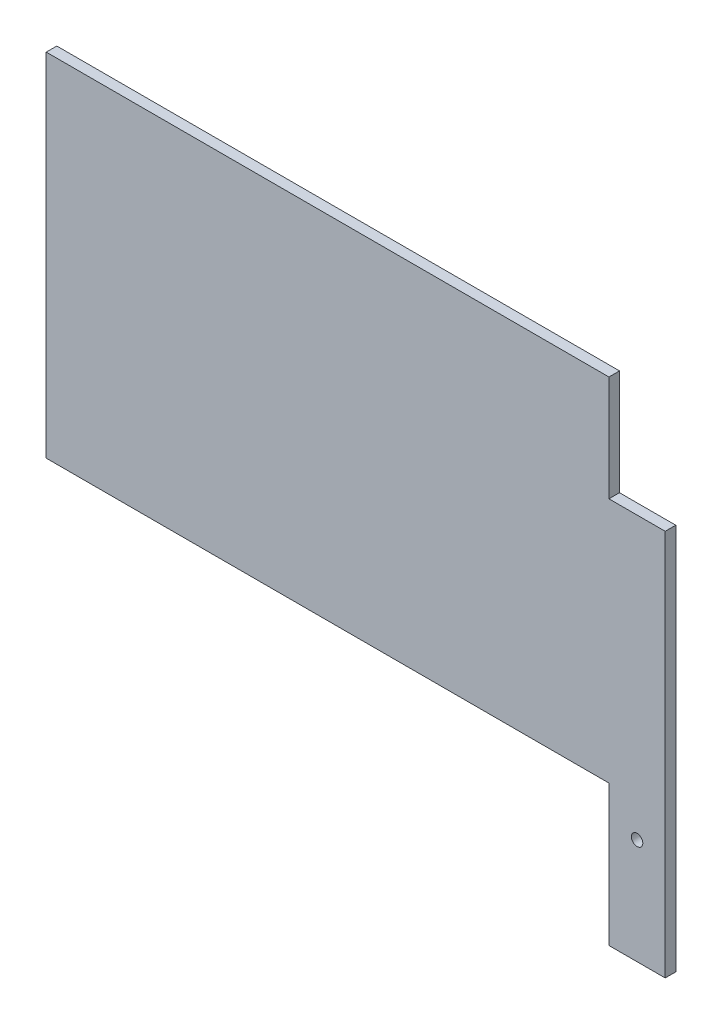
ISO-10303-21;
HEADER;
FILE_DESCRIPTION(('STEP AP214'),'2;1');
FILE_NAME('part.step','',(''),(''),'','','');
FILE_SCHEMA(('AUTOMOTIVE_DESIGN { 1 0 10303 214 1 1 1 1 }'));
ENDSEC;
DATA;
#1=APPLICATION_CONTEXT('core data for automotive mechanical design processes');
#2=APPLICATION_PROTOCOL_DEFINITION('international standard','automotive_design',2000,#1);
#3=PRODUCT_CONTEXT('',#1,'mechanical');
#4=PRODUCT('Part','Part','',(#3));
#5=PRODUCT_RELATED_PRODUCT_CATEGORY('part','',(#4));
#6=PRODUCT_DEFINITION_FORMATION('','',#4);
#7=PRODUCT_DEFINITION_CONTEXT('part definition',#1,'design');
#8=PRODUCT_DEFINITION('design','',#6,#7);
#9=PRODUCT_DEFINITION_SHAPE('','',#8);
#10=(LENGTH_UNIT() NAMED_UNIT(*) SI_UNIT(.MILLI.,.METRE.));
#11=(NAMED_UNIT(*) PLANE_ANGLE_UNIT() SI_UNIT($,.RADIAN.));
#12=(NAMED_UNIT(*) SI_UNIT($,.STERADIAN.) SOLID_ANGLE_UNIT());
#13=UNCERTAINTY_MEASURE_WITH_UNIT(LENGTH_MEASURE(1.E-05),#10,'distance_accuracy_value','');
#14=(GEOMETRIC_REPRESENTATION_CONTEXT(3) GLOBAL_UNCERTAINTY_ASSIGNED_CONTEXT((#13)) GLOBAL_UNIT_ASSIGNED_CONTEXT((#10,
#11,#12)) REPRESENTATION_CONTEXT('',''));
#15=CARTESIAN_POINT('',(0.,0.,0.));
#16=DIRECTION('',(0.,0.,1.));
#17=DIRECTION('',(1.,0.,0.));
#18=AXIS2_PLACEMENT_3D('',#15,#16,#17);
#19=CARTESIAN_POINT('',(53.2510288065843,19.5473251028807,1.5));
#20=DIRECTION('',(-1.,0.,0.));
#21=DIRECTION('',(0.,-1.,0.));
#22=AXIS2_PLACEMENT_3D('',#19,#20,#21);
#23=PLANE('',#22);
#24=DIRECTION('',(0.,0.,1.));
#25=VECTOR('',#24,1.);
#26=CARTESIAN_POINT('',(53.2510288065843,4.54732510288065,1.5));
#27=LINE('',#26,#25);
#28=CARTESIAN_POINT('',(53.2510288065843,4.54732510288065,0.));
#29=VERTEX_POINT('',#28);
#30=CARTESIAN_POINT('',(53.2510288065843,4.54732510288065,1.5));
#31=VERTEX_POINT('',#30);
#32=EDGE_CURVE('E56',#29,#31,#27,.T.);
#33=ORIENTED_EDGE('',*,*,#32,.F.);
#34=DIRECTION('',(0.,1.,0.));
#35=VECTOR('',#34,1.);
#36=CARTESIAN_POINT('',(53.2510288065843,19.5473251028807,0.));
#37=LINE('',#36,#35);
#38=CARTESIAN_POINT('',(53.2510288065843,19.5473251028807,0.));
#39=VERTEX_POINT('',#38);
#40=EDGE_CURVE('E158',#29,#39,#37,.T.);
#41=ORIENTED_EDGE('',*,*,#40,.T.);
#42=DIRECTION('',(0.,0.,-1.));
#43=VECTOR('',#42,1.);
#44=CARTESIAN_POINT('',(53.2510288065843,19.5473251028807,1.5));
#45=LINE('',#44,#43);
#46=CARTESIAN_POINT('',(53.2510288065843,19.5473251028807,1.5));
#47=VERTEX_POINT('',#46);
#48=EDGE_CURVE('E163',#47,#39,#45,.T.);
#49=ORIENTED_EDGE('',*,*,#48,.F.);
#50=DIRECTION('',(0.,1.,0.));
#51=VECTOR('',#50,1.);
#52=CARTESIAN_POINT('',(53.2510288065843,19.5473251028807,1.5));
#53=LINE('',#52,#51);
#54=EDGE_CURVE('E52',#31,#47,#53,.T.);
#55=ORIENTED_EDGE('',*,*,#54,.F.);
#56=EDGE_LOOP('',(#33,#41,#49,#55));
#57=FACE_BOUND('',#56,.T.);
#58=ADVANCED_FACE('F37',(#57),#23,.F.);
#59=CARTESIAN_POINT('',(-26.7489711934157,19.5473251028807,1.5));
#60=DIRECTION('',(1.,0.,0.));
#61=DIRECTION('',(0.,1.,0.));
#62=AXIS2_PLACEMENT_3D('',#59,#60,#61);
#63=PLANE('',#62);
#64=DIRECTION('',(0.,-1.,0.));
#65=VECTOR('',#64,1.);
#66=CARTESIAN_POINT('',(-26.7489711934157,19.5473251028807,0.));
#67=LINE('',#66,#65);
#68=CARTESIAN_POINT('',(-26.7489711934157,19.5473251028807,0.));
#69=VERTEX_POINT('',#68);
#70=CARTESIAN_POINT('',(-26.7489711934156,-30.4526748971193,0.));
#71=VERTEX_POINT('',#70);
#72=EDGE_CURVE('E142',#69,#71,#67,.T.);
#73=ORIENTED_EDGE('',*,*,#72,.T.);
#74=DIRECTION('',(0.,0.,-1.));
#75=VECTOR('',#74,1.);
#76=CARTESIAN_POINT('',(-26.7489711934156,-30.4526748971193,1.5));
#77=LINE('',#76,#75);
#78=CARTESIAN_POINT('',(-26.7489711934156,-30.4526748971193,1.5));
#79=VERTEX_POINT('',#78);
#80=EDGE_CURVE('E11',#79,#71,#77,.T.);
#81=ORIENTED_EDGE('',*,*,#80,.F.);
#82=DIRECTION('',(0.,-1.,0.));
#83=VECTOR('',#82,1.);
#84=CARTESIAN_POINT('',(-26.7489711934157,19.5473251028807,1.5));
#85=LINE('',#84,#83);
#86=CARTESIAN_POINT('',(-26.7489711934157,19.5473251028807,1.5));
#87=VERTEX_POINT('',#86);
#88=EDGE_CURVE('E143',#87,#79,#85,.T.);
#89=ORIENTED_EDGE('',*,*,#88,.F.);
#90=DIRECTION('',(0.,0.,-1.));
#91=VECTOR('',#90,1.);
#92=CARTESIAN_POINT('',(-26.7489711934157,19.5473251028807,1.5));
#93=LINE('',#92,#91);
#94=EDGE_CURVE('E153',#87,#69,#93,.T.);
#95=ORIENTED_EDGE('',*,*,#94,.T.);
#96=EDGE_LOOP('',(#73,#81,#89,#95));
#97=FACE_BOUND('',#96,.T.);
#98=ADVANCED_FACE('F39',(#97),#63,.F.);
#99=CARTESIAN_POINT('',(-26.7489711934156,-30.4526748971193,1.5));
#100=DIRECTION('',(0.,1.,0.));
#101=DIRECTION('',(0.,0.,1.));
#102=AXIS2_PLACEMENT_3D('',#99,#100,#101);
#103=PLANE('',#102);
#104=DIRECTION('',(1.,0.,0.));
#105=VECTOR('',#104,1.);
#106=CARTESIAN_POINT('',(-26.7489711934156,-30.4526748971193,0.));
#107=LINE('',#106,#105);
#108=CARTESIAN_POINT('',(53.2510288065843,-30.4526748971193,0.));
#109=VERTEX_POINT('',#108);
#110=EDGE_CURVE('E156',#71,#109,#107,.T.);
#111=ORIENTED_EDGE('',*,*,#110,.T.);
#112=DIRECTION('',(0.,0.,-1.));
#113=VECTOR('',#112,1.);
#114=CARTESIAN_POINT('',(53.2510288065843,-30.4526748971193,1.5));
#115=LINE('',#114,#113);
#116=CARTESIAN_POINT('',(53.2510288065843,-30.4526748971193,1.5));
#117=VERTEX_POINT('',#116);
#118=EDGE_CURVE('E45',#117,#109,#115,.T.);
#119=ORIENTED_EDGE('',*,*,#118,.F.);
#120=DIRECTION('',(1.,0.,0.));
#121=VECTOR('',#120,1.);
#122=CARTESIAN_POINT('',(-26.7489711934156,-30.4526748971193,1.5));
#123=LINE('',#122,#121);
#124=EDGE_CURVE('E146',#79,#117,#123,.T.);
#125=ORIENTED_EDGE('',*,*,#124,.F.);
#126=ORIENTED_EDGE('',*,*,#80,.T.);
#127=EDGE_LOOP('',(#111,#119,#125,#126));
#128=FACE_BOUND('',#127,.T.);
#129=ADVANCED_FACE('F211',(#128),#103,.F.);
#130=CARTESIAN_POINT('',(-26.7489711934157,19.5473251028807,1.5));
#131=DIRECTION('',(0.,-1.,0.));
#132=DIRECTION('',(0.,0.,-1.));
#133=AXIS2_PLACEMENT_3D('',#130,#131,#132);
#134=PLANE('',#133);
#135=DIRECTION('',(-1.,0.,0.));
#136=VECTOR('',#135,1.);
#137=CARTESIAN_POINT('',(-26.7489711934157,19.5473251028807,0.));
#138=LINE('',#137,#136);
#139=EDGE_CURVE('E147',#39,#69,#138,.T.);
#140=ORIENTED_EDGE('',*,*,#139,.T.);
#141=ORIENTED_EDGE('',*,*,#94,.F.);
#142=DIRECTION('',(-1.,0.,0.));
#143=VECTOR('',#142,1.);
#144=CARTESIAN_POINT('',(-26.7489711934157,19.5473251028807,1.5));
#145=LINE('',#144,#143);
#146=EDGE_CURVE('E151',#47,#87,#145,.T.);
#147=ORIENTED_EDGE('',*,*,#146,.F.);
#148=ORIENTED_EDGE('',*,*,#48,.T.);
#149=EDGE_LOOP('',(#140,#141,#147,#148));
#150=FACE_BOUND('',#149,.T.);
#151=ADVANCED_FACE('F168',(#150),#134,.F.);
#152=CARTESIAN_POINT('',(0.,0.,1.5));
#153=DIRECTION('',(0.,0.,1.));
#154=DIRECTION('',(1.,0.,0.));
#155=AXIS2_PLACEMENT_3D('',#152,#153,#154);
#156=PLANE('',#155);
#157=CARTESIAN_POINT('',(57.2510288065843,-35.4526748971193,1.5));
#158=DIRECTION('',(0.,0.,-1.));
#159=DIRECTION('',(0.,1.,0.));
#160=AXIS2_PLACEMENT_3D('',#157,#158,#159);
#161=CIRCLE('',#160,0.815000000000004);
#162=CARTESIAN_POINT('',(57.2510288065843,-34.6376748971193,1.5));
#163=VERTEX_POINT('',#162);
#164=EDGE_CURVE('E121',#163,#163,#161,.T.);
#165=ORIENTED_EDGE('',*,*,#164,.T.);
#166=EDGE_LOOP('',(#165));
#167=FACE_BOUND('',#166,.T.);
#168=ORIENTED_EDGE('',*,*,#88,.T.);
#169=ORIENTED_EDGE('',*,*,#124,.T.);
#170=DIRECTION('',(0.,1.,0.));
#171=VECTOR('',#170,1.);
#172=CARTESIAN_POINT('',(53.2510288065843,-50.4526748971194,1.5));
#173=LINE('',#172,#171);
#174=CARTESIAN_POINT('',(53.2510288065843,-50.4526748971194,1.5));
#175=VERTEX_POINT('',#174);
#176=EDGE_CURVE('E125',#175,#117,#173,.T.);
#177=ORIENTED_EDGE('',*,*,#176,.F.);
#178=DIRECTION('',(-1.,0.,0.));
#179=VECTOR('',#178,1.);
#180=CARTESIAN_POINT('',(53.2510288065843,-50.4526748971194,1.5));
#181=LINE('',#180,#179);
#182=CARTESIAN_POINT('',(61.2510288065843,-50.4526748971194,1.5));
#183=VERTEX_POINT('',#182);
#184=EDGE_CURVE('E118',#183,#175,#181,.T.);
#185=ORIENTED_EDGE('',*,*,#184,.F.);
#186=DIRECTION('',(0.,-1.,0.));
#187=VECTOR('',#186,1.);
#188=CARTESIAN_POINT('',(61.2510288065843,4.54732510288065,1.5));
#189=LINE('',#188,#187);
#190=CARTESIAN_POINT('',(61.2510288065843,4.54732510288065,1.5));
#191=VERTEX_POINT('',#190);
#192=EDGE_CURVE('E127',#191,#183,#189,.T.);
#193=ORIENTED_EDGE('',*,*,#192,.F.);
#194=DIRECTION('',(-1.,0.,0.));
#195=VECTOR('',#194,1.);
#196=CARTESIAN_POINT('',(61.2510288065843,4.54732510288065,1.5));
#197=LINE('',#196,#195);
#198=EDGE_CURVE('E135',#191,#31,#197,.T.);
#199=ORIENTED_EDGE('',*,*,#198,.T.);
#200=ORIENTED_EDGE('',*,*,#54,.T.);
#201=ORIENTED_EDGE('',*,*,#146,.T.);
#202=EDGE_LOOP('',(#168,#169,#177,#185,#193,#199,#200,#201));
#203=FACE_BOUND('',#202,.T.);
#204=ADVANCED_FACE('F174',(#167,#203),#156,.T.);
#205=CARTESIAN_POINT('',(0.,0.,0.));
#206=DIRECTION('',(0.,0.,1.));
#207=DIRECTION('',(1.,0.,0.));
#208=AXIS2_PLACEMENT_3D('',#205,#206,#207);
#209=PLANE('',#208);
#210=CARTESIAN_POINT('',(57.2510288065843,-35.4526748971193,0.));
#211=DIRECTION('',(0.,0.,-1.));
#212=DIRECTION('',(0.,1.,0.));
#213=AXIS2_PLACEMENT_3D('',#210,#211,#212);
#214=CIRCLE('',#213,0.815000000000004);
#215=CARTESIAN_POINT('',(57.2510288065843,-34.6376748971193,0.));
#216=VERTEX_POINT('',#215);
#217=EDGE_CURVE('E184',#216,#216,#214,.T.);
#218=ORIENTED_EDGE('',*,*,#217,.F.);
#219=EDGE_LOOP('',(#218));
#220=FACE_BOUND('',#219,.T.);
#221=ORIENTED_EDGE('',*,*,#72,.F.);
#222=ORIENTED_EDGE('',*,*,#139,.F.);
#223=ORIENTED_EDGE('',*,*,#40,.F.);
#224=DIRECTION('',(-1.,0.,0.));
#225=VECTOR('',#224,1.);
#226=CARTESIAN_POINT('',(61.2510288065843,4.54732510288065,0.));
#227=LINE('',#226,#225);
#228=CARTESIAN_POINT('',(61.2510288065843,4.54732510288065,0.));
#229=VERTEX_POINT('',#228);
#230=EDGE_CURVE('E139',#229,#29,#227,.T.);
#231=ORIENTED_EDGE('',*,*,#230,.F.);
#232=DIRECTION('',(0.,1.,0.));
#233=VECTOR('',#232,1.);
#234=CARTESIAN_POINT('',(61.2510288065843,4.54732510288065,0.));
#235=LINE('',#234,#233);
#236=CARTESIAN_POINT('',(61.2510288065843,-50.4526748971194,0.));
#237=VERTEX_POINT('',#236);
#238=EDGE_CURVE('E108',#237,#229,#235,.T.);
#239=ORIENTED_EDGE('',*,*,#238,.F.);
#240=DIRECTION('',(1.,0.,0.));
#241=VECTOR('',#240,1.);
#242=CARTESIAN_POINT('',(53.2510288065843,-50.4526748971194,0.));
#243=LINE('',#242,#241);
#244=CARTESIAN_POINT('',(53.2510288065843,-50.4526748971194,0.));
#245=VERTEX_POINT('',#244);
#246=EDGE_CURVE('E100',#245,#237,#243,.T.);
#247=ORIENTED_EDGE('',*,*,#246,.F.);
#248=DIRECTION('',(0.,1.,0.));
#249=VECTOR('',#248,1.);
#250=CARTESIAN_POINT('',(53.2510288065843,-50.4526748971194,0.));
#251=LINE('',#250,#249);
#252=EDGE_CURVE('E105',#245,#109,#251,.T.);
#253=ORIENTED_EDGE('',*,*,#252,.T.);
#254=ORIENTED_EDGE('',*,*,#110,.F.);
#255=EDGE_LOOP('',(#221,#222,#223,#231,#239,#247,#253,#254));
#256=FACE_BOUND('',#255,.T.);
#257=ADVANCED_FACE('F103',(#220,#256),#209,.F.);
#258=CARTESIAN_POINT('',(61.2510288065843,4.54732510288065,1.5));
#259=DIRECTION('',(0.,-1.,0.));
#260=DIRECTION('',(1.,0.,0.));
#261=AXIS2_PLACEMENT_3D('',#258,#259,#260);
#262=PLANE('',#261);
#263=ORIENTED_EDGE('',*,*,#32,.T.);
#264=ORIENTED_EDGE('',*,*,#198,.F.);
#265=DIRECTION('',(0.,0.,1.));
#266=VECTOR('',#265,1.);
#267=CARTESIAN_POINT('',(61.2510288065843,4.54732510288065,1.5));
#268=LINE('',#267,#266);
#269=EDGE_CURVE('E134',#229,#191,#268,.T.);
#270=ORIENTED_EDGE('',*,*,#269,.F.);
#271=ORIENTED_EDGE('',*,*,#230,.T.);
#272=EDGE_LOOP('',(#263,#264,#270,#271));
#273=FACE_BOUND('',#272,.T.);
#274=ADVANCED_FACE('F179',(#273),#262,.F.);
#275=CARTESIAN_POINT('',(61.2510288065843,0.,0.));
#276=DIRECTION('',(1.,0.,0.));
#277=DIRECTION('',(0.,0.,-1.));
#278=AXIS2_PLACEMENT_3D('',#275,#276,#277);
#279=PLANE('',#278);
#280=ORIENTED_EDGE('',*,*,#192,.T.);
#281=DIRECTION('',(0.,0.,1.));
#282=VECTOR('',#281,1.);
#283=CARTESIAN_POINT('',(61.2510288065843,-50.4526748971194,1.5));
#284=LINE('',#283,#282);
#285=EDGE_CURVE('E112',#237,#183,#284,.T.);
#286=ORIENTED_EDGE('',*,*,#285,.F.);
#287=ORIENTED_EDGE('',*,*,#238,.T.);
#288=ORIENTED_EDGE('',*,*,#269,.T.);
#289=EDGE_LOOP('',(#280,#286,#287,#288));
#290=FACE_BOUND('',#289,.T.);
#291=ADVANCED_FACE('F181',(#290),#279,.T.);
#292=CARTESIAN_POINT('',(53.2510288065843,-50.4526748971194,1.5));
#293=DIRECTION('',(1.,0.,0.));
#294=DIRECTION('',(0.,1.,0.));
#295=AXIS2_PLACEMENT_3D('',#292,#293,#294);
#296=PLANE('',#295);
#297=ORIENTED_EDGE('',*,*,#176,.T.);
#298=ORIENTED_EDGE('',*,*,#118,.T.);
#299=ORIENTED_EDGE('',*,*,#252,.F.);
#300=DIRECTION('',(0.,0.,-1.));
#301=VECTOR('',#300,1.);
#302=CARTESIAN_POINT('',(53.2510288065843,-50.4526748971194,1.5));
#303=LINE('',#302,#301);
#304=EDGE_CURVE('E113',#175,#245,#303,.T.);
#305=ORIENTED_EDGE('',*,*,#304,.F.);
#306=EDGE_LOOP('',(#297,#298,#299,#305));
#307=FACE_BOUND('',#306,.T.);
#308=ADVANCED_FACE('F123',(#307),#296,.F.);
#309=CARTESIAN_POINT('',(0.,-50.4526748971194,0.));
#310=DIRECTION('',(0.,-1.,0.));
#311=DIRECTION('',(0.,0.,-1.));
#312=AXIS2_PLACEMENT_3D('',#309,#310,#311);
#313=PLANE('',#312);
#314=ORIENTED_EDGE('',*,*,#304,.T.);
#315=ORIENTED_EDGE('',*,*,#246,.T.);
#316=ORIENTED_EDGE('',*,*,#285,.T.);
#317=ORIENTED_EDGE('',*,*,#184,.T.);
#318=EDGE_LOOP('',(#314,#315,#316,#317));
#319=FACE_BOUND('',#318,.T.);
#320=ADVANCED_FACE('F116',(#319),#313,.T.);
#321=CARTESIAN_POINT('',(57.2510288065843,-35.4526748971193,1.5));
#322=DIRECTION('',(0.,0.,-1.));
#323=DIRECTION('',(0.,1.,0.));
#324=AXIS2_PLACEMENT_3D('',#321,#322,#323);
#325=CYLINDRICAL_SURFACE('',#324,0.815000000000004);
#326=ORIENTED_EDGE('',*,*,#164,.F.);
#327=EDGE_LOOP('',(#326));
#328=FACE_BOUND('',#327,.T.);
#329=ORIENTED_EDGE('',*,*,#217,.T.);
#330=EDGE_LOOP('',(#329));
#331=FACE_BOUND('',#330,.T.);
#332=ADVANCED_FACE('F191',(#328,#331),#325,.F.);
#333=CLOSED_SHELL('',(#58,#98,#129,#151,#204,#257,#274,#291,#308,#320,#332));
#334=MANIFOLD_SOLID_BREP('B2',#333);
#335=ADVANCED_BREP_SHAPE_REPRESENTATION('',(#18,#334),#14);
#336=SHAPE_DEFINITION_REPRESENTATION(#9,#335);
ENDSEC;
END-ISO-10303-21;
